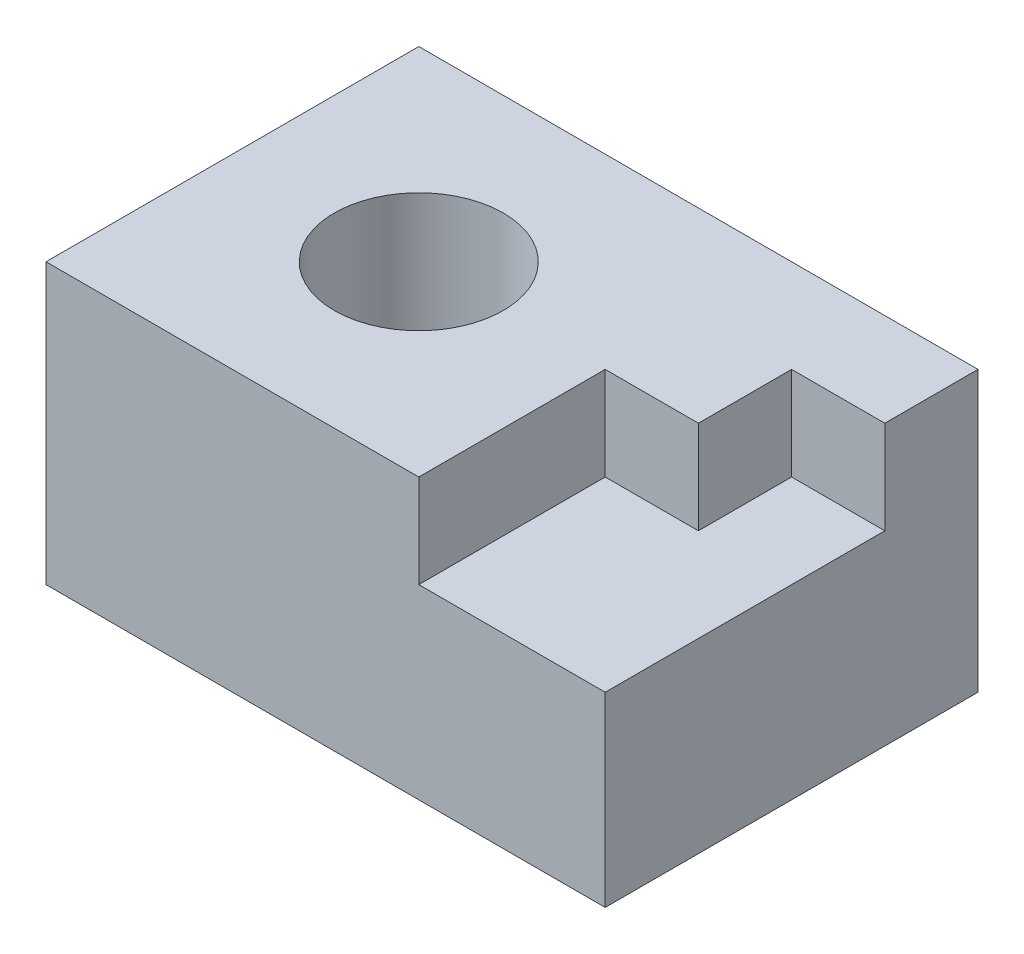
ISO-10303-21;
HEADER;
FILE_DESCRIPTION(('STEP AP214'),'2;1');
FILE_NAME('part.step','',(''),(''),'','','');
FILE_SCHEMA(('AUTOMOTIVE_DESIGN { 1 0 10303 214 1 1 1 1 }'));
ENDSEC;
DATA;
#1=APPLICATION_CONTEXT('core data for automotive mechanical design processes');
#2=APPLICATION_PROTOCOL_DEFINITION('international standard','automotive_design',2000,#1);
#3=PRODUCT_CONTEXT('',#1,'mechanical');
#4=PRODUCT('Part','Part','',(#3));
#5=PRODUCT_RELATED_PRODUCT_CATEGORY('part','',(#4));
#6=PRODUCT_DEFINITION_FORMATION('','',#4);
#7=PRODUCT_DEFINITION_CONTEXT('part definition',#1,'design');
#8=PRODUCT_DEFINITION('design','',#6,#7);
#9=PRODUCT_DEFINITION_SHAPE('','',#8);
#10=(LENGTH_UNIT() NAMED_UNIT(*) SI_UNIT(.MILLI.,.METRE.));
#11=(NAMED_UNIT(*) PLANE_ANGLE_UNIT() SI_UNIT($,.RADIAN.));
#12=(NAMED_UNIT(*) SI_UNIT($,.STERADIAN.) SOLID_ANGLE_UNIT());
#13=UNCERTAINTY_MEASURE_WITH_UNIT(LENGTH_MEASURE(1.E-05),#10,'distance_accuracy_value','');
#14=(GEOMETRIC_REPRESENTATION_CONTEXT(3) GLOBAL_UNCERTAINTY_ASSIGNED_CONTEXT((#13)) GLOBAL_UNIT_ASSIGNED_CONTEXT((#10,
#11,#12)) REPRESENTATION_CONTEXT('',''));
#15=CARTESIAN_POINT('',(0.,0.,0.));
#16=DIRECTION('',(0.,0.,1.));
#17=DIRECTION('',(1.,0.,0.));
#18=AXIS2_PLACEMENT_3D('',#15,#16,#17);
#19=CARTESIAN_POINT('',(76.2,76.2,50.8));
#20=DIRECTION('',(-1.,0.,0.));
#21=DIRECTION('',(0.,0.,1.));
#22=AXIS2_PLACEMENT_3D('',#19,#20,#21);
#23=PLANE('',#22);
#24=DIRECTION('',(0.,0.,-1.));
#25=VECTOR('',#24,1.);
#26=CARTESIAN_POINT('',(76.2,76.2,50.8));
#27=LINE('',#26,#25);
#28=CARTESIAN_POINT('',(76.2,76.2,-25.4));
#29=VERTEX_POINT('',#28);
#30=CARTESIAN_POINT('',(76.2,76.2,-50.8));
#31=VERTEX_POINT('',#30);
#32=EDGE_CURVE('E87',#29,#31,#27,.T.);
#33=ORIENTED_EDGE('',*,*,#32,.F.);
#34=DIRECTION('',(0.,1.,0.));
#35=VECTOR('',#34,1.);
#36=CARTESIAN_POINT('',(76.2,50.8,-25.4));
#37=LINE('',#36,#35);
#38=CARTESIAN_POINT('',(76.2,50.8,-25.4));
#39=VERTEX_POINT('',#38);
#40=EDGE_CURVE('E53',#39,#29,#37,.T.);
#41=ORIENTED_EDGE('',*,*,#40,.F.);
#42=DIRECTION('',(0.,0.,-1.));
#43=VECTOR('',#42,1.);
#44=CARTESIAN_POINT('',(76.2,50.8,50.8));
#45=LINE('',#44,#43);
#46=CARTESIAN_POINT('',(76.2,50.8,50.8));
#47=VERTEX_POINT('',#46);
#48=EDGE_CURVE('E120',#47,#39,#45,.T.);
#49=ORIENTED_EDGE('',*,*,#48,.F.);
#50=DIRECTION('',(0.,-1.,0.));
#51=VECTOR('',#50,1.);
#52=CARTESIAN_POINT('',(76.2,76.2,50.8));
#53=LINE('',#52,#51);
#54=CARTESIAN_POINT('',(76.2,0.,50.8));
#55=VERTEX_POINT('',#54);
#56=EDGE_CURVE('E83',#47,#55,#53,.T.);
#57=ORIENTED_EDGE('',*,*,#56,.T.);
#58=DIRECTION('',(0.,0.,-1.));
#59=VECTOR('',#58,1.);
#60=CARTESIAN_POINT('',(76.2,0.,50.8));
#61=LINE('',#60,#59);
#62=CARTESIAN_POINT('',(76.2,0.,-50.8));
#63=VERTEX_POINT('',#62);
#64=EDGE_CURVE('E149',#55,#63,#61,.T.);
#65=ORIENTED_EDGE('',*,*,#64,.T.);
#66=DIRECTION('',(0.,-1.,0.));
#67=VECTOR('',#66,1.);
#68=CARTESIAN_POINT('',(76.2,76.2,-50.8));
#69=LINE('',#68,#67);
#70=EDGE_CURVE('E11',#31,#63,#69,.T.);
#71=ORIENTED_EDGE('',*,*,#70,.F.);
#72=EDGE_LOOP('',(#33,#41,#49,#57,#65,#71));
#73=FACE_BOUND('',#72,.T.);
#74=ADVANCED_FACE('F39',(#73),#23,.F.);
#75=CARTESIAN_POINT('',(-76.2,76.2,-50.8));
#76=DIRECTION('',(0.,0.,1.));
#77=DIRECTION('',(1.,0.,0.));
#78=AXIS2_PLACEMENT_3D('',#75,#76,#77);
#79=PLANE('',#78);
#80=DIRECTION('',(-1.,0.,0.));
#81=VECTOR('',#80,1.);
#82=CARTESIAN_POINT('',(-76.2,0.,-50.8));
#83=LINE('',#82,#81);
#84=CARTESIAN_POINT('',(-76.2,0.,-50.8));
#85=VERTEX_POINT('',#84);
#86=EDGE_CURVE('E151',#63,#85,#83,.T.);
#87=ORIENTED_EDGE('',*,*,#86,.T.);
#88=DIRECTION('',(0.,-1.,0.));
#89=VECTOR('',#88,1.);
#90=CARTESIAN_POINT('',(-76.2,76.2,-50.8));
#91=LINE('',#90,#89);
#92=CARTESIAN_POINT('',(-76.2,76.2,-50.8));
#93=VERTEX_POINT('',#92);
#94=EDGE_CURVE('E46',#93,#85,#91,.T.);
#95=ORIENTED_EDGE('',*,*,#94,.F.);
#96=DIRECTION('',(-1.,0.,0.));
#97=VECTOR('',#96,1.);
#98=CARTESIAN_POINT('',(-76.2,76.2,-50.8));
#99=LINE('',#98,#97);
#100=EDGE_CURVE('E143',#31,#93,#99,.T.);
#101=ORIENTED_EDGE('',*,*,#100,.F.);
#102=ORIENTED_EDGE('',*,*,#70,.T.);
#103=EDGE_LOOP('',(#87,#95,#101,#102));
#104=FACE_BOUND('',#103,.T.);
#105=ADVANCED_FACE('F228',(#104),#79,.F.);
#106=CARTESIAN_POINT('',(-76.2,76.2,50.8));
#107=DIRECTION('',(1.,0.,0.));
#108=DIRECTION('',(0.,0.,-1.));
#109=AXIS2_PLACEMENT_3D('',#106,#107,#108);
#110=PLANE('',#109);
#111=DIRECTION('',(0.,0.,1.));
#112=VECTOR('',#111,1.);
#113=CARTESIAN_POINT('',(-76.2,0.,50.8));
#114=LINE('',#113,#112);
#115=CARTESIAN_POINT('',(-76.2,0.,50.8));
#116=VERTEX_POINT('',#115);
#117=EDGE_CURVE('E154',#85,#116,#114,.T.);
#118=ORIENTED_EDGE('',*,*,#117,.T.);
#119=DIRECTION('',(0.,-1.,0.));
#120=VECTOR('',#119,1.);
#121=CARTESIAN_POINT('',(-76.2,76.2,50.8));
#122=LINE('',#121,#120);
#123=CARTESIAN_POINT('',(-76.2,76.2,50.8));
#124=VERTEX_POINT('',#123);
#125=EDGE_CURVE('E158',#124,#116,#122,.T.);
#126=ORIENTED_EDGE('',*,*,#125,.F.);
#127=DIRECTION('',(0.,0.,1.));
#128=VECTOR('',#127,1.);
#129=CARTESIAN_POINT('',(-76.2,76.2,50.8));
#130=LINE('',#129,#128);
#131=EDGE_CURVE('E62',#93,#124,#130,.T.);
#132=ORIENTED_EDGE('',*,*,#131,.F.);
#133=ORIENTED_EDGE('',*,*,#94,.T.);
#134=EDGE_LOOP('',(#118,#126,#132,#133));
#135=FACE_BOUND('',#134,.T.);
#136=ADVANCED_FACE('F164',(#135),#110,.F.);
#137=CARTESIAN_POINT('',(-76.2,76.2,50.8));
#138=DIRECTION('',(0.,0.,-1.));
#139=DIRECTION('',(-1.,0.,0.));
#140=AXIS2_PLACEMENT_3D('',#137,#138,#139);
#141=PLANE('',#140);
#142=DIRECTION('',(1.,0.,0.));
#143=VECTOR('',#142,1.);
#144=CARTESIAN_POINT('',(76.2,50.8,50.8));
#145=LINE('',#144,#143);
#146=CARTESIAN_POINT('',(25.4,50.8,50.8));
#147=VERTEX_POINT('',#146);
#148=EDGE_CURVE('E126',#147,#47,#145,.T.);
#149=ORIENTED_EDGE('',*,*,#148,.F.);
#150=DIRECTION('',(0.,1.,0.));
#151=VECTOR('',#150,1.);
#152=CARTESIAN_POINT('',(25.4,50.8,50.8));
#153=LINE('',#152,#151);
#154=CARTESIAN_POINT('',(25.4,76.2,50.8));
#155=VERTEX_POINT('',#154);
#156=EDGE_CURVE('E152',#147,#155,#153,.T.);
#157=ORIENTED_EDGE('',*,*,#156,.T.);
#158=DIRECTION('',(1.,0.,0.));
#159=VECTOR('',#158,1.);
#160=CARTESIAN_POINT('',(-76.2,76.2,50.8));
#161=LINE('',#160,#159);
#162=EDGE_CURVE('E147',#124,#155,#161,.T.);
#163=ORIENTED_EDGE('',*,*,#162,.F.);
#164=ORIENTED_EDGE('',*,*,#125,.T.);
#165=DIRECTION('',(1.,0.,0.));
#166=VECTOR('',#165,1.);
#167=CARTESIAN_POINT('',(-76.2,0.,50.8));
#168=LINE('',#167,#166);
#169=EDGE_CURVE('E144',#116,#55,#168,.T.);
#170=ORIENTED_EDGE('',*,*,#169,.T.);
#171=ORIENTED_EDGE('',*,*,#56,.F.);
#172=EDGE_LOOP('',(#149,#157,#163,#164,#170,#171));
#173=FACE_BOUND('',#172,.T.);
#174=ADVANCED_FACE('F171',(#173),#141,.F.);
#175=CARTESIAN_POINT('',(0.,76.2,0.));
#176=DIRECTION('',(0.,-1.,0.));
#177=DIRECTION('',(0.,0.,-1.));
#178=AXIS2_PLACEMENT_3D('',#175,#176,#177);
#179=PLANE('',#178);
#180=CARTESIAN_POINT('',(-25.4,76.2,0.));
#181=DIRECTION('',(0.,1.,0.));
#182=DIRECTION('',(0.,0.,1.));
#183=AXIS2_PLACEMENT_3D('',#180,#181,#182);
#184=CIRCLE('',#183,23.0337191662983);
#185=CARTESIAN_POINT('',(-25.4,76.2,23.0337191662983));
#186=VERTEX_POINT('',#185);
#187=EDGE_CURVE('E203',#186,#186,#184,.T.);
#188=ORIENTED_EDGE('',*,*,#187,.F.);
#189=EDGE_LOOP('',(#188));
#190=FACE_BOUND('',#189,.T.);
#191=ORIENTED_EDGE('',*,*,#162,.T.);
#192=DIRECTION('',(0.,0.,1.));
#193=VECTOR('',#192,1.);
#194=CARTESIAN_POINT('',(25.4,76.2,50.8));
#195=LINE('',#194,#193);
#196=CARTESIAN_POINT('',(25.4,76.2,0.));
#197=VERTEX_POINT('',#196);
#198=EDGE_CURVE('E127',#197,#155,#195,.T.);
#199=ORIENTED_EDGE('',*,*,#198,.F.);
#200=DIRECTION('',(-1.,0.,0.));
#201=VECTOR('',#200,1.);
#202=CARTESIAN_POINT('',(50.8,76.2,0.));
#203=LINE('',#202,#201);
#204=CARTESIAN_POINT('',(50.8,76.2,0.));
#205=VERTEX_POINT('',#204);
#206=EDGE_CURVE('E179',#205,#197,#203,.T.);
#207=ORIENTED_EDGE('',*,*,#206,.F.);
#208=DIRECTION('',(0.,0.,1.));
#209=VECTOR('',#208,1.);
#210=CARTESIAN_POINT('',(50.8,76.2,0.));
#211=LINE('',#210,#209);
#212=CARTESIAN_POINT('',(50.8,76.2,-25.4));
#213=VERTEX_POINT('',#212);
#214=EDGE_CURVE('E182',#213,#205,#211,.T.);
#215=ORIENTED_EDGE('',*,*,#214,.F.);
#216=DIRECTION('',(-1.,0.,0.));
#217=VECTOR('',#216,1.);
#218=CARTESIAN_POINT('',(76.2,76.2,-25.4));
#219=LINE('',#218,#217);
#220=EDGE_CURVE('E196',#29,#213,#219,.T.);
#221=ORIENTED_EDGE('',*,*,#220,.F.);
#222=ORIENTED_EDGE('',*,*,#32,.T.);
#223=ORIENTED_EDGE('',*,*,#100,.T.);
#224=ORIENTED_EDGE('',*,*,#131,.T.);
#225=EDGE_LOOP('',(#191,#199,#207,#215,#221,#222,#223,#224));
#226=FACE_BOUND('',#225,.T.);
#227=ADVANCED_FACE('F175',(#190,#226),#179,.F.);
#228=CARTESIAN_POINT('',(0.,0.,0.));
#229=DIRECTION('',(0.,-1.,0.));
#230=DIRECTION('',(0.,0.,-1.));
#231=AXIS2_PLACEMENT_3D('',#228,#229,#230);
#232=PLANE('',#231);
#233=CARTESIAN_POINT('',(-25.4,0.,0.));
#234=DIRECTION('',(0.,1.,0.));
#235=DIRECTION('',(0.,0.,1.));
#236=AXIS2_PLACEMENT_3D('',#233,#234,#235);
#237=CIRCLE('',#236,23.0337191662983);
#238=CARTESIAN_POINT('',(-25.4,0.,23.0337191662983));
#239=VERTEX_POINT('',#238);
#240=EDGE_CURVE('E197',#239,#239,#237,.T.);
#241=ORIENTED_EDGE('',*,*,#240,.T.);
#242=EDGE_LOOP('',(#241));
#243=FACE_BOUND('',#242,.T.);
#244=ORIENTED_EDGE('',*,*,#64,.F.);
#245=ORIENTED_EDGE('',*,*,#169,.F.);
#246=ORIENTED_EDGE('',*,*,#117,.F.);
#247=ORIENTED_EDGE('',*,*,#86,.F.);
#248=EDGE_LOOP('',(#244,#245,#246,#247));
#249=FACE_BOUND('',#248,.T.);
#250=ADVANCED_FACE('F169',(#243,#249),#232,.T.);
#251=CARTESIAN_POINT('',(25.4,50.8,50.8));
#252=DIRECTION('',(-1.,0.,0.));
#253=DIRECTION('',(0.,0.,1.));
#254=AXIS2_PLACEMENT_3D('',#251,#252,#253);
#255=PLANE('',#254);
#256=ORIENTED_EDGE('',*,*,#198,.T.);
#257=ORIENTED_EDGE('',*,*,#156,.F.);
#258=DIRECTION('',(0.,0.,1.));
#259=VECTOR('',#258,1.);
#260=CARTESIAN_POINT('',(25.4,50.8,50.8));
#261=LINE('',#260,#259);
#262=CARTESIAN_POINT('',(25.4,50.8,0.));
#263=VERTEX_POINT('',#262);
#264=EDGE_CURVE('E138',#263,#147,#261,.T.);
#265=ORIENTED_EDGE('',*,*,#264,.F.);
#266=DIRECTION('',(0.,1.,0.));
#267=VECTOR('',#266,1.);
#268=CARTESIAN_POINT('',(25.4,50.8,0.));
#269=LINE('',#268,#267);
#270=EDGE_CURVE('E187',#263,#197,#269,.T.);
#271=ORIENTED_EDGE('',*,*,#270,.T.);
#272=EDGE_LOOP('',(#256,#257,#265,#271));
#273=FACE_BOUND('',#272,.T.);
#274=ADVANCED_FACE('F222',(#273),#255,.F.);
#275=CARTESIAN_POINT('',(50.8,50.8,0.));
#276=DIRECTION('',(0.,0.,-1.));
#277=DIRECTION('',(-1.,0.,0.));
#278=AXIS2_PLACEMENT_3D('',#275,#276,#277);
#279=PLANE('',#278);
#280=ORIENTED_EDGE('',*,*,#206,.T.);
#281=ORIENTED_EDGE('',*,*,#270,.F.);
#282=DIRECTION('',(-1.,0.,0.));
#283=VECTOR('',#282,1.);
#284=CARTESIAN_POINT('',(50.8,50.8,0.));
#285=LINE('',#284,#283);
#286=CARTESIAN_POINT('',(50.8,50.8,0.));
#287=VERTEX_POINT('',#286);
#288=EDGE_CURVE('E193',#287,#263,#285,.T.);
#289=ORIENTED_EDGE('',*,*,#288,.F.);
#290=DIRECTION('',(0.,1.,0.));
#291=VECTOR('',#290,1.);
#292=CARTESIAN_POINT('',(50.8,50.8,0.));
#293=LINE('',#292,#291);
#294=EDGE_CURVE('E136',#287,#205,#293,.T.);
#295=ORIENTED_EDGE('',*,*,#294,.T.);
#296=EDGE_LOOP('',(#280,#281,#289,#295));
#297=FACE_BOUND('',#296,.T.);
#298=ADVANCED_FACE('F191',(#297),#279,.F.);
#299=CARTESIAN_POINT('',(50.8,50.8,0.));
#300=DIRECTION('',(-1.,0.,0.));
#301=DIRECTION('',(0.,0.,1.));
#302=AXIS2_PLACEMENT_3D('',#299,#300,#301);
#303=PLANE('',#302);
#304=ORIENTED_EDGE('',*,*,#214,.T.);
#305=ORIENTED_EDGE('',*,*,#294,.F.);
#306=DIRECTION('',(0.,0.,1.));
#307=VECTOR('',#306,1.);
#308=CARTESIAN_POINT('',(50.8,50.8,0.));
#309=LINE('',#308,#307);
#310=CARTESIAN_POINT('',(50.8,50.8,-25.4));
#311=VERTEX_POINT('',#310);
#312=EDGE_CURVE('E132',#311,#287,#309,.T.);
#313=ORIENTED_EDGE('',*,*,#312,.F.);
#314=DIRECTION('',(0.,1.,0.));
#315=VECTOR('',#314,1.);
#316=CARTESIAN_POINT('',(50.8,50.8,-25.4));
#317=LINE('',#316,#315);
#318=EDGE_CURVE('E130',#311,#213,#317,.T.);
#319=ORIENTED_EDGE('',*,*,#318,.T.);
#320=EDGE_LOOP('',(#304,#305,#313,#319));
#321=FACE_BOUND('',#320,.T.);
#322=ADVANCED_FACE('F195',(#321),#303,.F.);
#323=CARTESIAN_POINT('',(76.2,50.8,-25.4));
#324=DIRECTION('',(0.,0.,-1.));
#325=DIRECTION('',(-1.,0.,0.));
#326=AXIS2_PLACEMENT_3D('',#323,#324,#325);
#327=PLANE('',#326);
#328=ORIENTED_EDGE('',*,*,#220,.T.);
#329=ORIENTED_EDGE('',*,*,#318,.F.);
#330=DIRECTION('',(-1.,0.,0.));
#331=VECTOR('',#330,1.);
#332=CARTESIAN_POINT('',(76.2,50.8,-25.4));
#333=LINE('',#332,#331);
#334=EDGE_CURVE('E123',#39,#311,#333,.T.);
#335=ORIENTED_EDGE('',*,*,#334,.F.);
#336=ORIENTED_EDGE('',*,*,#40,.T.);
#337=EDGE_LOOP('',(#328,#329,#335,#336));
#338=FACE_BOUND('',#337,.T.);
#339=ADVANCED_FACE('F129',(#338),#327,.F.);
#340=CARTESIAN_POINT('',(0.,50.8,0.));
#341=DIRECTION('',(0.,1.,0.));
#342=DIRECTION('',(0.,0.,1.));
#343=AXIS2_PLACEMENT_3D('',#340,#341,#342);
#344=PLANE('',#343);
#345=ORIENTED_EDGE('',*,*,#48,.T.);
#346=ORIENTED_EDGE('',*,*,#334,.T.);
#347=ORIENTED_EDGE('',*,*,#312,.T.);
#348=ORIENTED_EDGE('',*,*,#288,.T.);
#349=ORIENTED_EDGE('',*,*,#264,.T.);
#350=ORIENTED_EDGE('',*,*,#148,.T.);
#351=EDGE_LOOP('',(#345,#346,#347,#348,#349,#350));
#352=FACE_BOUND('',#351,.T.);
#353=ADVANCED_FACE('F121',(#352),#344,.T.);
#354=CARTESIAN_POINT('',(-25.4,0.,0.));
#355=DIRECTION('',(0.,1.,0.));
#356=DIRECTION('',(0.,0.,1.));
#357=AXIS2_PLACEMENT_3D('',#354,#355,#356);
#358=CYLINDRICAL_SURFACE('',#357,23.0337191662983);
#359=CARTESIAN_POINT('',(-25.4,0.,23.0337191662983));
#360=CARTESIAN_POINT('',(-25.4,0.79375,23.0337191662983));
#361=CARTESIAN_POINT('',(-25.4,1.5875,23.0337191662983));
#362=CARTESIAN_POINT('',(-25.4,3.175,23.0337191662983));
#363=CARTESIAN_POINT('',(-25.4,3.96875,23.0337191662983));
#364=CARTESIAN_POINT('',(-25.4,5.55625,23.0337191662983));
#365=CARTESIAN_POINT('',(-25.4,6.35,23.0337191662983));
#366=CARTESIAN_POINT('',(-25.4,7.9375,23.0337191662983));
#367=CARTESIAN_POINT('',(-25.4,8.73125,23.0337191662983));
#368=CARTESIAN_POINT('',(-25.4,10.31875,23.0337191662983));
#369=CARTESIAN_POINT('',(-25.4,11.1125,23.0337191662983));
#370=CARTESIAN_POINT('',(-25.4,12.7,23.0337191662983));
#371=CARTESIAN_POINT('',(-25.4,13.49375,23.0337191662983));
#372=CARTESIAN_POINT('',(-25.4,15.08125,23.0337191662983));
#373=CARTESIAN_POINT('',(-25.4,15.875,23.0337191662983));
#374=CARTESIAN_POINT('',(-25.4,17.4625,23.0337191662983));
#375=CARTESIAN_POINT('',(-25.4,18.25625,23.0337191662983));
#376=CARTESIAN_POINT('',(-25.4,19.84375,23.0337191662983));
#377=CARTESIAN_POINT('',(-25.4,20.6375,23.0337191662983));
#378=CARTESIAN_POINT('',(-25.4,22.225,23.0337191662983));
#379=CARTESIAN_POINT('',(-25.4,23.01875,23.0337191662983));
#380=CARTESIAN_POINT('',(-25.4,24.60625,23.0337191662983));
#381=CARTESIAN_POINT('',(-25.4,25.4,23.0337191662983));
#382=CARTESIAN_POINT('',(-25.4,26.9875,23.0337191662983));
#383=CARTESIAN_POINT('',(-25.4,27.78125,23.0337191662983));
#384=CARTESIAN_POINT('',(-25.4,29.36875,23.0337191662983));
#385=CARTESIAN_POINT('',(-25.4,30.1625,23.0337191662983));
#386=CARTESIAN_POINT('',(-25.4,31.75,23.0337191662983));
#387=CARTESIAN_POINT('',(-25.4,32.54375,23.0337191662983));
#388=CARTESIAN_POINT('',(-25.4,34.13125,23.0337191662983));
#389=CARTESIAN_POINT('',(-25.4,34.925,23.0337191662983));
#390=CARTESIAN_POINT('',(-25.4,36.5125,23.0337191662983));
#391=CARTESIAN_POINT('',(-25.4,37.30625,23.0337191662983));
#392=CARTESIAN_POINT('',(-25.4,38.89375,23.0337191662983));
#393=CARTESIAN_POINT('',(-25.4,39.6875,23.0337191662983));
#394=CARTESIAN_POINT('',(-25.4,41.275,23.0337191662983));
#395=CARTESIAN_POINT('',(-25.4,42.06875,23.0337191662983));
#396=CARTESIAN_POINT('',(-25.4,43.65625,23.0337191662983));
#397=CARTESIAN_POINT('',(-25.4,44.45,23.0337191662983));
#398=CARTESIAN_POINT('',(-25.4,46.0375,23.0337191662983));
#399=CARTESIAN_POINT('',(-25.4,46.83125,23.0337191662983));
#400=CARTESIAN_POINT('',(-25.4,48.41875,23.0337191662983));
#401=CARTESIAN_POINT('',(-25.4,49.2125,23.0337191662983));
#402=CARTESIAN_POINT('',(-25.4,50.8,23.0337191662983));
#403=CARTESIAN_POINT('',(-25.4,51.59375,23.0337191662983));
#404=CARTESIAN_POINT('',(-25.4,53.18125,23.0337191662983));
#405=CARTESIAN_POINT('',(-25.4,53.975,23.0337191662983));
#406=CARTESIAN_POINT('',(-25.4,55.5625,23.0337191662983));
#407=CARTESIAN_POINT('',(-25.4,56.35625,23.0337191662983));
#408=CARTESIAN_POINT('',(-25.4,57.94375,23.0337191662983));
#409=CARTESIAN_POINT('',(-25.4,58.7375,23.0337191662983));
#410=CARTESIAN_POINT('',(-25.4,60.325,23.0337191662983));
#411=CARTESIAN_POINT('',(-25.4,61.11875,23.0337191662983));
#412=CARTESIAN_POINT('',(-25.4,62.70625,23.0337191662983));
#413=CARTESIAN_POINT('',(-25.4,63.5,23.0337191662983));
#414=CARTESIAN_POINT('',(-25.4,65.0875,23.0337191662983));
#415=CARTESIAN_POINT('',(-25.4,65.88125,23.0337191662983));
#416=CARTESIAN_POINT('',(-25.4,67.46875,23.0337191662983));
#417=CARTESIAN_POINT('',(-25.4,68.2625,23.0337191662983));
#418=CARTESIAN_POINT('',(-25.4,69.85,23.0337191662983));
#419=CARTESIAN_POINT('',(-25.4,70.64375,23.0337191662983));
#420=CARTESIAN_POINT('',(-25.4,72.23125,23.0337191662983));
#421=CARTESIAN_POINT('',(-25.4,73.025,23.0337191662983));
#422=CARTESIAN_POINT('',(-25.4,74.6125,23.0337191662983));
#423=CARTESIAN_POINT('',(-25.4,75.40625,23.0337191662983));
#424=CARTESIAN_POINT('',(-25.4,76.2,23.0337191662983));
#425=B_SPLINE_CURVE_WITH_KNOTS('',3,(#359,#360,#361,#362,#363,#364,#365,#366,#367,#368,#369,
#370,#371,#372,#373,#374,#375,#376,#377,#378,#379,#380,#381,#382,#383,#384,#385,#386,#387,#388,
#389,#390,#391,#392,#393,#394,#395,#396,#397,#398,#399,#400,#401,#402,#403,#404,#405,#406,#407,
#408,#409,#410,#411,#412,#413,#414,#415,#416,#417,#418,#419,#420,#421,#422,#423,#424),
.UNSPECIFIED.,.F.,.F.,(4,2,2,2,2,2,2,2,2,2,2,2,2,2,2,2,2,2,2,2,2,2,2,2,2,2,2,2,2,2,2,2,4),(0.,
2.38125,4.7625,7.14375,9.525,11.90625,14.2875,16.66875,19.05,21.43125,23.8125,26.19375,28.575,
30.95625,33.3375,35.71875,38.1,40.48125,42.8625,45.24375,47.625,50.00625,52.3875,54.76875,57.15,
59.53125,61.9125,64.29375,66.675,69.05625,71.4375,73.81875,76.2),.UNSPECIFIED.);
#426=EDGE_CURVE('BSEAM210',#239,#186,#425,.T.);
#427=ORIENTED_EDGE('',*,*,#240,.F.);
#428=ORIENTED_EDGE('',*,*,#187,.T.);
#429=ORIENTED_EDGE('',*,*,#426,.T.);
#430=ORIENTED_EDGE('',*,*,#426,.F.);
#431=EDGE_LOOP('',(#427,#429,#428,#430));
#432=FACE_BOUND('',#431,.T.);
#433=ADVANCED_FACE('F210',(#432),#358,.F.);
#434=CLOSED_SHELL('',(#74,#105,#136,#174,#227,#250,#274,#298,#322,#339,#353,#433));
#435=MANIFOLD_SOLID_BREP('B2',#434);
#436=ADVANCED_BREP_SHAPE_REPRESENTATION('',(#18,#435),#14);
#437=SHAPE_DEFINITION_REPRESENTATION(#9,#436);
ENDSEC;
END-ISO-10303-21;
